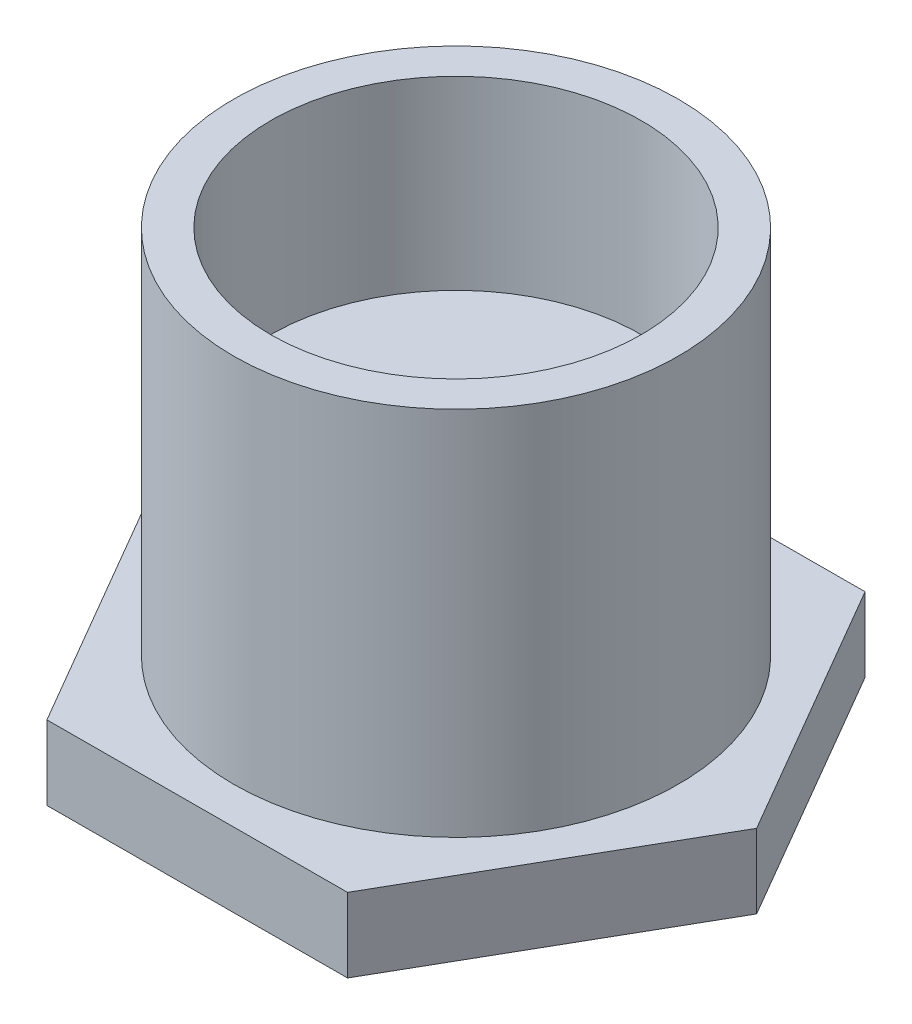
ISO-10303-21;
HEADER;
FILE_DESCRIPTION(('STEP AP214'),'2;1');
FILE_NAME('part.step','',(''),(''),'','','');
FILE_SCHEMA(('AUTOMOTIVE_DESIGN { 1 0 10303 214 1 1 1 1 }'));
ENDSEC;
DATA;
#1=APPLICATION_CONTEXT('core data for automotive mechanical design processes');
#2=APPLICATION_PROTOCOL_DEFINITION('international standard','automotive_design',2000,#1);
#3=PRODUCT_CONTEXT('',#1,'mechanical');
#4=PRODUCT('Part','Part','',(#3));
#5=PRODUCT_RELATED_PRODUCT_CATEGORY('part','',(#4));
#6=PRODUCT_DEFINITION_FORMATION('','',#4);
#7=PRODUCT_DEFINITION_CONTEXT('part definition',#1,'design');
#8=PRODUCT_DEFINITION('design','',#6,#7);
#9=PRODUCT_DEFINITION_SHAPE('','',#8);
#10=(LENGTH_UNIT() NAMED_UNIT(*) SI_UNIT(.MILLI.,.METRE.));
#11=(NAMED_UNIT(*) PLANE_ANGLE_UNIT() SI_UNIT($,.RADIAN.));
#12=(NAMED_UNIT(*) SI_UNIT($,.STERADIAN.) SOLID_ANGLE_UNIT());
#13=UNCERTAINTY_MEASURE_WITH_UNIT(LENGTH_MEASURE(1.E-05),#10,'distance_accuracy_value','');
#14=(GEOMETRIC_REPRESENTATION_CONTEXT(3) GLOBAL_UNCERTAINTY_ASSIGNED_CONTEXT((#13)) GLOBAL_UNIT_ASSIGNED_CONTEXT((#10,
#11,#12)) REPRESENTATION_CONTEXT('',''));
#15=CARTESIAN_POINT('',(0.,0.,0.));
#16=DIRECTION('',(0.,0.,1.));
#17=DIRECTION('',(1.,0.,0.));
#18=AXIS2_PLACEMENT_3D('',#15,#16,#17);
#19=CARTESIAN_POINT('',(-4.01992845877706,2.,7.01238251378571));
#20=DIRECTION('',(-0.00307205070190148,0.,-0.999995281241109));
#21=DIRECTION('',(-0.999995281241109,0.,0.00307205070190148));
#22=AXIS2_PLACEMENT_3D('',#19,#20,#21);
#23=PLANE('',#22);
#24=DIRECTION('',(0.999995281241109,0.,-0.00307205070190148));
#25=VECTOR('',#24,1.);
#26=CARTESIAN_POINT('',(-4.01992845877706,0.,7.01238251378571));
#27=LINE('',#26,#25);
#28=CARTESIAN_POINT('',(-4.01992845877706,0.,7.01238251378571));
#29=VERTEX_POINT('',#28);
#30=CARTESIAN_POINT('',(4.06293716860368,0.,6.98755142358981));
#31=VERTEX_POINT('',#30);
#32=EDGE_CURVE('E117',#29,#31,#27,.T.);
#33=ORIENTED_EDGE('',*,*,#32,.T.);
#34=DIRECTION('',(0.,-1.,0.));
#35=VECTOR('',#34,1.);
#36=CARTESIAN_POINT('',(4.06293716860368,2.,6.98755142358981));
#37=LINE('',#36,#35);
#38=CARTESIAN_POINT('',(4.06293716860368,2.,6.98755142358981));
#39=VERTEX_POINT('',#38);
#40=EDGE_CURVE('E11',#39,#31,#37,.T.);
#41=ORIENTED_EDGE('',*,*,#40,.F.);
#42=DIRECTION('',(0.999995281241109,0.,-0.00307205070190148));
#43=VECTOR('',#42,1.);
#44=CARTESIAN_POINT('',(-4.01992845877706,2.,7.01238251378571));
#45=LINE('',#44,#43);
#46=CARTESIAN_POINT('',(-4.01992845877706,2.,7.01238251378571));
#47=VERTEX_POINT('',#46);
#48=EDGE_CURVE('E128',#47,#39,#45,.T.);
#49=ORIENTED_EDGE('',*,*,#48,.F.);
#50=DIRECTION('',(0.,-1.,0.));
#51=VECTOR('',#50,1.);
#52=CARTESIAN_POINT('',(-4.01992845877706,2.,7.01238251378571));
#53=LINE('',#52,#51);
#54=EDGE_CURVE('E113',#47,#29,#53,.T.);
#55=ORIENTED_EDGE('',*,*,#54,.T.);
#56=EDGE_LOOP('',(#33,#41,#49,#55));
#57=FACE_BOUND('',#56,.T.);
#58=ADVANCED_FACE('F33',(#57),#23,.F.);
#59=CARTESIAN_POINT('',(4.06293716860368,2.,6.98755142358981));
#60=DIRECTION('',(-0.867557342570315,0.,-0.497337166670994));
#61=DIRECTION('',(-0.497337166670994,0.,0.867557342570316));
#62=AXIS2_PLACEMENT_3D('',#59,#60,#61);
#63=PLANE('',#62);
#64=DIRECTION('',(0.497337166670994,0.,-0.867557342570316));
#65=VECTOR('',#64,1.);
#66=CARTESIAN_POINT('',(4.06293716860368,0.,6.98755142358981));
#67=LINE('',#66,#65);
#68=CARTESIAN_POINT('',(8.08286562738074,0.,-0.0248310901958984));
#69=VERTEX_POINT('',#68);
#70=EDGE_CURVE('E120',#31,#69,#67,.T.);
#71=ORIENTED_EDGE('',*,*,#70,.T.);
#72=DIRECTION('',(0.,-1.,0.));
#73=VECTOR('',#72,1.);
#74=CARTESIAN_POINT('',(8.08286562738074,2.,-0.0248310901958984));
#75=LINE('',#74,#73);
#76=CARTESIAN_POINT('',(8.08286562738074,2.,-0.0248310901958984));
#77=VERTEX_POINT('',#76);
#78=EDGE_CURVE('E41',#77,#69,#75,.T.);
#79=ORIENTED_EDGE('',*,*,#78,.F.);
#80=DIRECTION('',(0.497337166670994,0.,-0.867557342570316));
#81=VECTOR('',#80,1.);
#82=CARTESIAN_POINT('',(4.06293716860368,2.,6.98755142358981));
#83=LINE('',#82,#81);
#84=EDGE_CURVE('E86',#39,#77,#83,.T.);
#85=ORIENTED_EDGE('',*,*,#84,.F.);
#86=ORIENTED_EDGE('',*,*,#40,.T.);
#87=EDGE_LOOP('',(#71,#79,#85,#86));
#88=FACE_BOUND('',#87,.T.);
#89=ADVANCED_FACE('F153',(#88),#63,.F.);
#90=CARTESIAN_POINT('',(8.08286562738074,2.,-0.0248310901958984));
#91=DIRECTION('',(-0.864485291868414,0.,0.502658114570115));
#92=DIRECTION('',(0.502658114570115,0.,0.864485291868414));
#93=AXIS2_PLACEMENT_3D('',#90,#91,#92);
#94=PLANE('',#93);
#95=DIRECTION('',(-0.502658114570115,0.,-0.864485291868414));
#96=VECTOR('',#95,1.);
#97=CARTESIAN_POINT('',(8.08286562738074,0.,-0.0248310901958984));
#98=LINE('',#97,#96);
#99=CARTESIAN_POINT('',(4.01992845877706,0.,-7.01238251378571));
#100=VERTEX_POINT('',#99);
#101=EDGE_CURVE('E123',#69,#100,#98,.T.);
#102=ORIENTED_EDGE('',*,*,#101,.T.);
#103=DIRECTION('',(0.,-1.,0.));
#104=VECTOR('',#103,1.);
#105=CARTESIAN_POINT('',(4.01992845877706,2.,-7.01238251378571));
#106=LINE('',#105,#104);
#107=CARTESIAN_POINT('',(4.01992845877706,2.,-7.01238251378571));
#108=VERTEX_POINT('',#107);
#109=EDGE_CURVE('E108',#108,#100,#106,.T.);
#110=ORIENTED_EDGE('',*,*,#109,.F.);
#111=DIRECTION('',(-0.502658114570115,0.,-0.864485291868414));
#112=VECTOR('',#111,1.);
#113=CARTESIAN_POINT('',(8.08286562738074,2.,-0.0248310901958984));
#114=LINE('',#113,#112);
#115=EDGE_CURVE('E99',#77,#108,#114,.T.);
#116=ORIENTED_EDGE('',*,*,#115,.F.);
#117=ORIENTED_EDGE('',*,*,#78,.T.);
#118=EDGE_LOOP('',(#102,#110,#116,#117));
#119=FACE_BOUND('',#118,.T.);
#120=ADVANCED_FACE('F134',(#119),#94,.F.);
#121=CARTESIAN_POINT('',(4.01992845877706,2.,-7.01238251378571));
#122=DIRECTION('',(0.00307205070190137,0.,0.999995281241109));
#123=DIRECTION('',(0.999995281241109,0.,-0.00307205070190137));
#124=AXIS2_PLACEMENT_3D('',#121,#122,#123);
#125=PLANE('',#124);
#126=DIRECTION('',(-0.999995281241109,0.,0.00307205070190137));
#127=VECTOR('',#126,1.);
#128=CARTESIAN_POINT('',(4.01992845877706,0.,-7.01238251378571));
#129=LINE('',#128,#127);
#130=CARTESIAN_POINT('',(-4.06293716860368,0.,-6.98755142358982));
#131=VERTEX_POINT('',#130);
#132=EDGE_CURVE('E107',#100,#131,#129,.T.);
#133=ORIENTED_EDGE('',*,*,#132,.T.);
#134=DIRECTION('',(0.,-1.,0.));
#135=VECTOR('',#134,1.);
#136=CARTESIAN_POINT('',(-4.06293716860368,2.,-6.98755142358982));
#137=LINE('',#136,#135);
#138=CARTESIAN_POINT('',(-4.06293716860368,2.,-6.98755142358982));
#139=VERTEX_POINT('',#138);
#140=EDGE_CURVE('E104',#139,#131,#137,.T.);
#141=ORIENTED_EDGE('',*,*,#140,.F.);
#142=DIRECTION('',(-0.999995281241109,0.,0.00307205070190137));
#143=VECTOR('',#142,1.);
#144=CARTESIAN_POINT('',(4.01992845877706,2.,-7.01238251378571));
#145=LINE('',#144,#143);
#146=EDGE_CURVE('E93',#108,#139,#145,.T.);
#147=ORIENTED_EDGE('',*,*,#146,.F.);
#148=ORIENTED_EDGE('',*,*,#109,.T.);
#149=EDGE_LOOP('',(#133,#141,#147,#148));
#150=FACE_BOUND('',#149,.T.);
#151=ADVANCED_FACE('F105',(#150),#125,.F.);
#152=CARTESIAN_POINT('',(-4.06293716860368,2.,-6.98755142358982));
#153=DIRECTION('',(0.867557342570316,0.,0.497337166670994));
#154=DIRECTION('',(0.497337166670994,0.,-0.867557342570316));
#155=AXIS2_PLACEMENT_3D('',#152,#153,#154);
#156=PLANE('',#155);
#157=DIRECTION('',(-0.497337166670994,0.,0.867557342570316));
#158=VECTOR('',#157,1.);
#159=CARTESIAN_POINT('',(-4.06293716860368,0.,-6.98755142358982));
#160=LINE('',#159,#158);
#161=CARTESIAN_POINT('',(-8.08286562738074,0.,0.024831090195898));
#162=VERTEX_POINT('',#161);
#163=EDGE_CURVE('E72',#131,#162,#160,.T.);
#164=ORIENTED_EDGE('',*,*,#163,.T.);
#165=DIRECTION('',(0.,-1.,0.));
#166=VECTOR('',#165,1.);
#167=CARTESIAN_POINT('',(-8.08286562738074,2.,0.024831090195898));
#168=LINE('',#167,#166);
#169=CARTESIAN_POINT('',(-8.08286562738074,2.,0.024831090195898));
#170=VERTEX_POINT('',#169);
#171=EDGE_CURVE('E109',#170,#162,#168,.T.);
#172=ORIENTED_EDGE('',*,*,#171,.F.);
#173=DIRECTION('',(-0.497337166670994,0.,0.867557342570316));
#174=VECTOR('',#173,1.);
#175=CARTESIAN_POINT('',(-4.06293716860368,2.,-6.98755142358982));
#176=LINE('',#175,#174);
#177=EDGE_CURVE('E97',#139,#170,#176,.T.);
#178=ORIENTED_EDGE('',*,*,#177,.F.);
#179=ORIENTED_EDGE('',*,*,#140,.T.);
#180=EDGE_LOOP('',(#164,#172,#178,#179));
#181=FACE_BOUND('',#180,.T.);
#182=ADVANCED_FACE('F111',(#181),#156,.F.);
#183=CARTESIAN_POINT('',(-8.08286562738074,2.,0.024831090195898));
#184=DIRECTION('',(0.864485291868414,0.,-0.502658114570115));
#185=DIRECTION('',(-0.502658114570115,0.,-0.864485291868414));
#186=AXIS2_PLACEMENT_3D('',#183,#184,#185);
#187=PLANE('',#186);
#188=DIRECTION('',(0.502658114570115,0.,0.864485291868414));
#189=VECTOR('',#188,1.);
#190=CARTESIAN_POINT('',(-8.08286562738074,0.,0.024831090195898));
#191=LINE('',#190,#189);
#192=EDGE_CURVE('E78',#162,#29,#191,.T.);
#193=ORIENTED_EDGE('',*,*,#192,.T.);
#194=ORIENTED_EDGE('',*,*,#54,.F.);
#195=DIRECTION('',(0.502658114570115,0.,0.864485291868414));
#196=VECTOR('',#195,1.);
#197=CARTESIAN_POINT('',(-8.08286562738074,2.,0.024831090195898));
#198=LINE('',#197,#196);
#199=EDGE_CURVE('E49',#170,#47,#198,.T.);
#200=ORIENTED_EDGE('',*,*,#199,.F.);
#201=ORIENTED_EDGE('',*,*,#171,.T.);
#202=EDGE_LOOP('',(#193,#194,#200,#201));
#203=FACE_BOUND('',#202,.T.);
#204=ADVANCED_FACE('F141',(#203),#187,.F.);
#205=CARTESIAN_POINT('',(0.,2.,0.));
#206=DIRECTION('',(0.,1.,0.));
#207=DIRECTION('',(0.,0.,1.));
#208=AXIS2_PLACEMENT_3D('',#205,#206,#207);
#209=PLANE('',#208);
#210=CARTESIAN_POINT('',(0.,2.,0.));
#211=DIRECTION('',(0.,1.,0.));
#212=DIRECTION('',(0.,0.,1.));
#213=AXIS2_PLACEMENT_3D('',#210,#211,#212);
#214=CIRCLE('',#213,6.);
#215=CARTESIAN_POINT('',(0.,2.,6.));
#216=VERTEX_POINT('',#215);
#217=EDGE_CURVE('E235',#216,#216,#214,.T.);
#218=ORIENTED_EDGE('',*,*,#217,.F.);
#219=EDGE_LOOP('',(#218));
#220=FACE_BOUND('',#219,.T.);
#221=ORIENTED_EDGE('',*,*,#48,.T.);
#222=ORIENTED_EDGE('',*,*,#84,.T.);
#223=ORIENTED_EDGE('',*,*,#115,.T.);
#224=ORIENTED_EDGE('',*,*,#146,.T.);
#225=ORIENTED_EDGE('',*,*,#177,.T.);
#226=ORIENTED_EDGE('',*,*,#199,.T.);
#227=EDGE_LOOP('',(#221,#222,#223,#224,#225,#226));
#228=FACE_BOUND('',#227,.T.);
#229=ADVANCED_FACE('F95',(#220,#228),#209,.T.);
#230=CARTESIAN_POINT('',(0.,0.,0.));
#231=DIRECTION('',(0.,1.,0.));
#232=DIRECTION('',(0.,0.,1.));
#233=AXIS2_PLACEMENT_3D('',#230,#231,#232);
#234=PLANE('',#233);
#235=ORIENTED_EDGE('',*,*,#32,.F.);
#236=ORIENTED_EDGE('',*,*,#192,.F.);
#237=ORIENTED_EDGE('',*,*,#163,.F.);
#238=ORIENTED_EDGE('',*,*,#132,.F.);
#239=ORIENTED_EDGE('',*,*,#101,.F.);
#240=ORIENTED_EDGE('',*,*,#70,.F.);
#241=EDGE_LOOP('',(#235,#236,#237,#238,#239,#240));
#242=FACE_BOUND('',#241,.T.);
#243=ADVANCED_FACE('F137',(#242),#234,.F.);
#244=CARTESIAN_POINT('',(0.,12.,0.));
#245=DIRECTION('',(0.,-1.,0.));
#246=DIRECTION('',(0.,0.,-1.));
#247=AXIS2_PLACEMENT_3D('',#244,#245,#246);
#248=CYLINDRICAL_SURFACE('',#247,6.);
#249=CARTESIAN_POINT('',(0.,12.,0.));
#250=DIRECTION('',(0.,1.,0.));
#251=DIRECTION('',(0.,0.,1.));
#252=AXIS2_PLACEMENT_3D('',#249,#250,#251);
#253=CIRCLE('',#252,6.);
#254=CARTESIAN_POINT('',(0.,12.,6.));
#255=VERTEX_POINT('',#254);
#256=EDGE_CURVE('E121',#255,#255,#253,.T.);
#257=ORIENTED_EDGE('',*,*,#256,.F.);
#258=EDGE_LOOP('',(#257));
#259=FACE_BOUND('',#258,.T.);
#260=ORIENTED_EDGE('',*,*,#217,.T.);
#261=EDGE_LOOP('',(#260));
#262=FACE_BOUND('',#261,.T.);
#263=ADVANCED_FACE('F185',(#259,#262),#248,.T.);
#264=CARTESIAN_POINT('',(0.,12.,0.));
#265=DIRECTION('',(0.,1.,0.));
#266=DIRECTION('',(0.,0.,1.));
#267=AXIS2_PLACEMENT_3D('',#264,#265,#266);
#268=PLANE('',#267);
#269=CARTESIAN_POINT('',(0.,12.,0.));
#270=DIRECTION('',(0.,1.,0.));
#271=DIRECTION('',(0.,0.,1.));
#272=AXIS2_PLACEMENT_3D('',#269,#270,#271);
#273=CIRCLE('',#272,5.);
#274=CARTESIAN_POINT('',(0.,12.,5.));
#275=VERTEX_POINT('',#274);
#276=EDGE_CURVE('E236',#275,#275,#273,.T.);
#277=ORIENTED_EDGE('',*,*,#276,.F.);
#278=EDGE_LOOP('',(#277));
#279=FACE_BOUND('',#278,.T.);
#280=ORIENTED_EDGE('',*,*,#256,.T.);
#281=EDGE_LOOP('',(#280));
#282=FACE_BOUND('',#281,.T.);
#283=ADVANCED_FACE('F198',(#279,#282),#268,.T.);
#284=CARTESIAN_POINT('',(0.,7.,0.));
#285=DIRECTION('',(0.,1.,0.));
#286=DIRECTION('',(0.,0.,1.));
#287=AXIS2_PLACEMENT_3D('',#284,#285,#286);
#288=CYLINDRICAL_SURFACE('',#287,5.);
#289=CARTESIAN_POINT('',(0.,7.,0.));
#290=DIRECTION('',(0.,1.,0.));
#291=DIRECTION('',(0.,0.,1.));
#292=AXIS2_PLACEMENT_3D('',#289,#290,#291);
#293=CIRCLE('',#292,5.);
#294=CARTESIAN_POINT('',(0.,7.,5.));
#295=VERTEX_POINT('',#294);
#296=EDGE_CURVE('E234',#295,#295,#293,.T.);
#297=ORIENTED_EDGE('',*,*,#296,.F.);
#298=EDGE_LOOP('',(#297));
#299=FACE_BOUND('',#298,.T.);
#300=ORIENTED_EDGE('',*,*,#276,.T.);
#301=EDGE_LOOP('',(#300));
#302=FACE_BOUND('',#301,.T.);
#303=ADVANCED_FACE('F208',(#299,#302),#288,.F.);
#304=CARTESIAN_POINT('',(0.,7.,0.));
#305=DIRECTION('',(0.,1.,0.));
#306=DIRECTION('',(0.,0.,1.));
#307=AXIS2_PLACEMENT_3D('',#304,#305,#306);
#308=PLANE('',#307);
#309=ORIENTED_EDGE('',*,*,#296,.T.);
#310=EDGE_LOOP('',(#309));
#311=FACE_BOUND('',#310,.T.);
#312=ADVANCED_FACE('F218',(#311),#308,.T.);
#313=CLOSED_SHELL('',(#58,#89,#120,#151,#182,#204,#229,#243,#263,#283,#303,#312));
#314=MANIFOLD_SOLID_BREP('B2',#313);
#315=ADVANCED_BREP_SHAPE_REPRESENTATION('',(#18,#314),#14);
#316=SHAPE_DEFINITION_REPRESENTATION(#9,#315);
ENDSEC;
END-ISO-10303-21;
